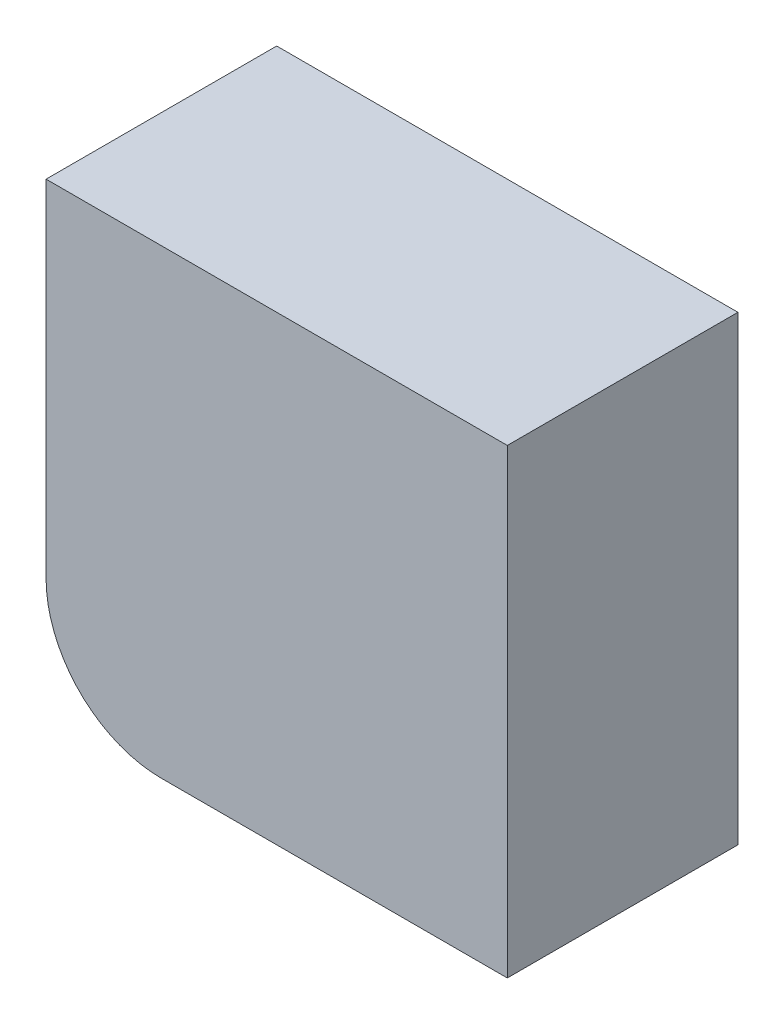
ISO-10303-21;
HEADER;
FILE_DESCRIPTION(('STEP AP214'),'2;1');
FILE_NAME('part.step','',(''),(''),'','','');
FILE_SCHEMA(('AUTOMOTIVE_DESIGN { 1 0 10303 214 1 1 1 1 }'));
ENDSEC;
DATA;
#1=APPLICATION_CONTEXT('core data for automotive mechanical design processes');
#2=APPLICATION_PROTOCOL_DEFINITION('international standard','automotive_design',2000,#1);
#3=PRODUCT_CONTEXT('',#1,'mechanical');
#4=PRODUCT('Part','Part','',(#3));
#5=PRODUCT_RELATED_PRODUCT_CATEGORY('part','',(#4));
#6=PRODUCT_DEFINITION_FORMATION('','',#4);
#7=PRODUCT_DEFINITION_CONTEXT('part definition',#1,'design');
#8=PRODUCT_DEFINITION('design','',#6,#7);
#9=PRODUCT_DEFINITION_SHAPE('','',#8);
#10=(LENGTH_UNIT() NAMED_UNIT(*) SI_UNIT(.MILLI.,.METRE.));
#11=(NAMED_UNIT(*) PLANE_ANGLE_UNIT() SI_UNIT($,.RADIAN.));
#12=(NAMED_UNIT(*) SI_UNIT($,.STERADIAN.) SOLID_ANGLE_UNIT());
#13=UNCERTAINTY_MEASURE_WITH_UNIT(LENGTH_MEASURE(1.E-05),#10,'distance_accuracy_value','');
#14=(GEOMETRIC_REPRESENTATION_CONTEXT(3) GLOBAL_UNCERTAINTY_ASSIGNED_CONTEXT((#13)) GLOBAL_UNIT_ASSIGNED_CONTEXT((#10,
#11,#12)) REPRESENTATION_CONTEXT('',''));
#15=CARTESIAN_POINT('',(0.,0.,0.));
#16=DIRECTION('',(0.,0.,1.));
#17=DIRECTION('',(1.,0.,0.));
#18=AXIS2_PLACEMENT_3D('',#15,#16,#17);
#19=CARTESIAN_POINT('',(5.,5.,10.));
#20=DIRECTION('',(0.,0.,1.));
#21=DIRECTION('',(1.,0.,0.));
#22=AXIS2_PLACEMENT_3D('',#19,#20,#21);
#23=CYLINDRICAL_SURFACE('',#22,5.);
#24=DIRECTION('',(0.,0.,1.));
#25=VECTOR('',#24,1.);
#26=CARTESIAN_POINT('',(0.,5.,10.));
#27=LINE('',#26,#25);
#28=CARTESIAN_POINT('',(0.,5.,0.));
#29=VERTEX_POINT('',#28);
#30=CARTESIAN_POINT('',(0.,5.,10.));
#31=VERTEX_POINT('',#30);
#32=EDGE_CURVE('E97',#29,#31,#27,.T.);
#33=ORIENTED_EDGE('',*,*,#32,.F.);
#34=CARTESIAN_POINT('',(5.,5.,0.));
#35=DIRECTION('',(0.,0.,-1.));
#36=DIRECTION('',(-1.,0.,0.));
#37=AXIS2_PLACEMENT_3D('',#34,#35,#36);
#38=CIRCLE('',#37,5.);
#39=CARTESIAN_POINT('',(5.,0.,0.));
#40=VERTEX_POINT('',#39);
#41=EDGE_CURVE('E47',#40,#29,#38,.T.);
#42=ORIENTED_EDGE('',*,*,#41,.F.);
#43=DIRECTION('',(0.,0.,1.));
#44=VECTOR('',#43,1.);
#45=CARTESIAN_POINT('',(5.,0.,10.));
#46=LINE('',#45,#44);
#47=CARTESIAN_POINT('',(5.,0.,10.));
#48=VERTEX_POINT('',#47);
#49=EDGE_CURVE('E125',#48,#40,#46,.F.);
#50=ORIENTED_EDGE('',*,*,#49,.F.);
#51=CARTESIAN_POINT('',(5.,5.,10.));
#52=DIRECTION('',(0.,0.,-1.));
#53=DIRECTION('',(-1.,0.,0.));
#54=AXIS2_PLACEMENT_3D('',#51,#52,#53);
#55=CIRCLE('',#54,5.);
#56=EDGE_CURVE('E11',#31,#48,#55,.F.);
#57=ORIENTED_EDGE('',*,*,#56,.F.);
#58=EDGE_LOOP('',(#33,#42,#50,#57));
#59=FACE_BOUND('',#58,.T.);
#60=ADVANCED_FACE('F45',(#59),#23,.T.);
#61=CARTESIAN_POINT('',(0.,0.,10.));
#62=DIRECTION('',(1.,0.,0.));
#63=DIRECTION('',(0.,0.,-1.));
#64=AXIS2_PLACEMENT_3D('',#61,#62,#63);
#65=PLANE('',#64);
#66=DIRECTION('',(0.,-1.,0.));
#67=VECTOR('',#66,1.);
#68=CARTESIAN_POINT('',(0.,0.,0.));
#69=LINE('',#68,#67);
#70=CARTESIAN_POINT('',(0.,20.,0.));
#71=VERTEX_POINT('',#70);
#72=EDGE_CURVE('E112',#71,#29,#69,.T.);
#73=ORIENTED_EDGE('',*,*,#72,.T.);
#74=ORIENTED_EDGE('',*,*,#32,.T.);
#75=DIRECTION('',(0.,-1.,0.));
#76=VECTOR('',#75,1.);
#77=CARTESIAN_POINT('',(0.,0.,10.));
#78=LINE('',#77,#76);
#79=CARTESIAN_POINT('',(0.,20.,10.));
#80=VERTEX_POINT('',#79);
#81=EDGE_CURVE('E89',#80,#31,#78,.T.);
#82=ORIENTED_EDGE('',*,*,#81,.F.);
#83=DIRECTION('',(0.,0.,-1.));
#84=VECTOR('',#83,1.);
#85=CARTESIAN_POINT('',(0.,20.,10.));
#86=LINE('',#85,#84);
#87=EDGE_CURVE('E110',#80,#71,#86,.T.);
#88=ORIENTED_EDGE('',*,*,#87,.T.);
#89=EDGE_LOOP('',(#73,#74,#82,#88));
#90=FACE_BOUND('',#89,.T.);
#91=ADVANCED_FACE('F133',(#90),#65,.F.);
#92=CARTESIAN_POINT('',(0.,0.,10.));
#93=DIRECTION('',(0.,1.,0.));
#94=DIRECTION('',(0.,0.,1.));
#95=AXIS2_PLACEMENT_3D('',#92,#93,#94);
#96=PLANE('',#95);
#97=DIRECTION('',(1.,0.,0.));
#98=VECTOR('',#97,1.);
#99=CARTESIAN_POINT('',(0.,0.,10.));
#100=LINE('',#99,#98);
#101=CARTESIAN_POINT('',(20.,0.,10.));
#102=VERTEX_POINT('',#101);
#103=EDGE_CURVE('E82',#48,#102,#100,.T.);
#104=ORIENTED_EDGE('',*,*,#103,.F.);
#105=ORIENTED_EDGE('',*,*,#49,.T.);
#106=DIRECTION('',(1.,0.,0.));
#107=VECTOR('',#106,1.);
#108=CARTESIAN_POINT('',(0.,0.,0.));
#109=LINE('',#108,#107);
#110=CARTESIAN_POINT('',(20.,0.,0.));
#111=VERTEX_POINT('',#110);
#112=EDGE_CURVE('E96',#40,#111,#109,.T.);
#113=ORIENTED_EDGE('',*,*,#112,.T.);
#114=DIRECTION('',(0.,0.,-1.));
#115=VECTOR('',#114,1.);
#116=CARTESIAN_POINT('',(20.,0.,10.));
#117=LINE('',#116,#115);
#118=EDGE_CURVE('E91',#102,#111,#117,.T.);
#119=ORIENTED_EDGE('',*,*,#118,.F.);
#120=EDGE_LOOP('',(#104,#105,#113,#119));
#121=FACE_BOUND('',#120,.T.);
#122=ADVANCED_FACE('F94',(#121),#96,.F.);
#123=CARTESIAN_POINT('',(20.,0.,10.));
#124=DIRECTION('',(-1.,0.,0.));
#125=DIRECTION('',(0.,0.,1.));
#126=AXIS2_PLACEMENT_3D('',#123,#124,#125);
#127=PLANE('',#126);
#128=DIRECTION('',(0.,1.,0.));
#129=VECTOR('',#128,1.);
#130=CARTESIAN_POINT('',(20.,0.,0.));
#131=LINE('',#130,#129);
#132=CARTESIAN_POINT('',(20.,20.,0.));
#133=VERTEX_POINT('',#132);
#134=EDGE_CURVE('E113',#111,#133,#131,.T.);
#135=ORIENTED_EDGE('',*,*,#134,.T.);
#136=DIRECTION('',(0.,0.,-1.));
#137=VECTOR('',#136,1.);
#138=CARTESIAN_POINT('',(20.,20.,10.));
#139=LINE('',#138,#137);
#140=CARTESIAN_POINT('',(20.,20.,10.));
#141=VERTEX_POINT('',#140);
#142=EDGE_CURVE('E99',#141,#133,#139,.T.);
#143=ORIENTED_EDGE('',*,*,#142,.F.);
#144=DIRECTION('',(0.,1.,0.));
#145=VECTOR('',#144,1.);
#146=CARTESIAN_POINT('',(20.,0.,10.));
#147=LINE('',#146,#145);
#148=EDGE_CURVE('E87',#102,#141,#147,.T.);
#149=ORIENTED_EDGE('',*,*,#148,.F.);
#150=ORIENTED_EDGE('',*,*,#118,.T.);
#151=EDGE_LOOP('',(#135,#143,#149,#150));
#152=FACE_BOUND('',#151,.T.);
#153=ADVANCED_FACE('F105',(#152),#127,.F.);
#154=CARTESIAN_POINT('',(0.,20.,10.));
#155=DIRECTION('',(0.,-1.,0.));
#156=DIRECTION('',(0.,0.,-1.));
#157=AXIS2_PLACEMENT_3D('',#154,#155,#156);
#158=PLANE('',#157);
#159=DIRECTION('',(-1.,0.,0.));
#160=VECTOR('',#159,1.);
#161=CARTESIAN_POINT('',(0.,20.,0.));
#162=LINE('',#161,#160);
#163=EDGE_CURVE('E119',#133,#71,#162,.T.);
#164=ORIENTED_EDGE('',*,*,#163,.T.);
#165=ORIENTED_EDGE('',*,*,#87,.F.);
#166=DIRECTION('',(-1.,0.,0.));
#167=VECTOR('',#166,1.);
#168=CARTESIAN_POINT('',(0.,20.,10.));
#169=LINE('',#168,#167);
#170=EDGE_CURVE('E104',#141,#80,#169,.T.);
#171=ORIENTED_EDGE('',*,*,#170,.F.);
#172=ORIENTED_EDGE('',*,*,#142,.T.);
#173=EDGE_LOOP('',(#164,#165,#171,#172));
#174=FACE_BOUND('',#173,.T.);
#175=ADVANCED_FACE('F135',(#174),#158,.F.);
#176=CARTESIAN_POINT('',(0.,0.,10.));
#177=DIRECTION('',(0.,0.,-1.));
#178=DIRECTION('',(-1.,0.,0.));
#179=AXIS2_PLACEMENT_3D('',#176,#177,#178);
#180=PLANE('',#179);
#181=ORIENTED_EDGE('',*,*,#81,.T.);
#182=ORIENTED_EDGE('',*,*,#56,.T.);
#183=ORIENTED_EDGE('',*,*,#103,.T.);
#184=ORIENTED_EDGE('',*,*,#148,.T.);
#185=ORIENTED_EDGE('',*,*,#170,.T.);
#186=EDGE_LOOP('',(#181,#182,#183,#184,#185));
#187=FACE_BOUND('',#186,.T.);
#188=ADVANCED_FACE('F84',(#187),#180,.F.);
#189=CARTESIAN_POINT('',(0.,0.,0.));
#190=DIRECTION('',(0.,0.,-1.));
#191=DIRECTION('',(-1.,0.,0.));
#192=AXIS2_PLACEMENT_3D('',#189,#190,#191);
#193=PLANE('',#192);
#194=ORIENTED_EDGE('',*,*,#112,.F.);
#195=ORIENTED_EDGE('',*,*,#41,.T.);
#196=ORIENTED_EDGE('',*,*,#72,.F.);
#197=ORIENTED_EDGE('',*,*,#163,.F.);
#198=ORIENTED_EDGE('',*,*,#134,.F.);
#199=EDGE_LOOP('',(#194,#195,#196,#197,#198));
#200=FACE_BOUND('',#199,.T.);
#201=ADVANCED_FACE('F130',(#200),#193,.T.);
#202=CLOSED_SHELL('',(#60,#91,#122,#153,#175,#188,#201));
#203=MANIFOLD_SOLID_BREP('B2',#202);
#204=ADVANCED_BREP_SHAPE_REPRESENTATION('',(#18,#203),#14);
#205=SHAPE_DEFINITION_REPRESENTATION(#9,#204);
ENDSEC;
END-ISO-10303-21;
